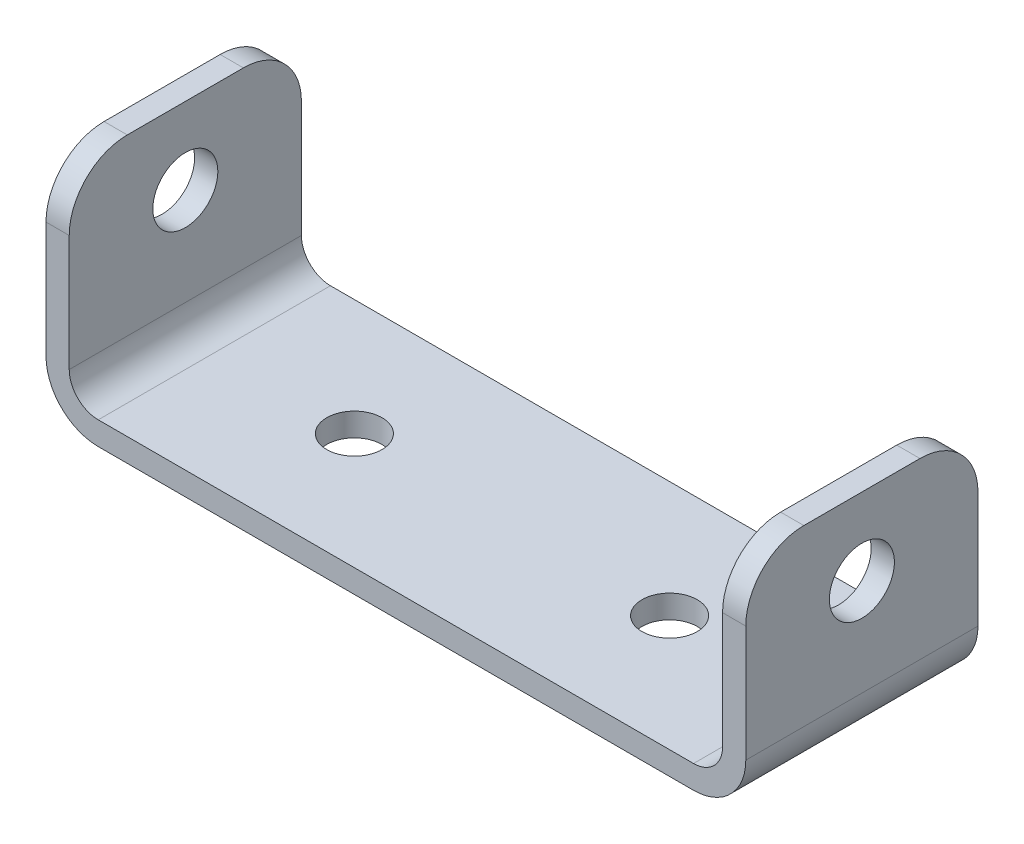
ISO-10303-21;
HEADER;
FILE_DESCRIPTION(('STEP AP214'),'2;1');
FILE_NAME('part.step','',(''),(''),'','','');
FILE_SCHEMA(('AUTOMOTIVE_DESIGN { 1 0 10303 214 1 1 1 1 }'));
ENDSEC;
DATA;
#1=APPLICATION_CONTEXT('core data for automotive mechanical design processes');
#2=APPLICATION_PROTOCOL_DEFINITION('international standard','automotive_design',2000,#1);
#3=PRODUCT_CONTEXT('',#1,'mechanical');
#4=PRODUCT('Part','Part','',(#3));
#5=PRODUCT_RELATED_PRODUCT_CATEGORY('part','',(#4));
#6=PRODUCT_DEFINITION_FORMATION('','',#4);
#7=PRODUCT_DEFINITION_CONTEXT('part definition',#1,'design');
#8=PRODUCT_DEFINITION('design','',#6,#7);
#9=PRODUCT_DEFINITION_SHAPE('','',#8);
#10=(LENGTH_UNIT() NAMED_UNIT(*) SI_UNIT(.MILLI.,.METRE.));
#11=(NAMED_UNIT(*) PLANE_ANGLE_UNIT() SI_UNIT($,.RADIAN.));
#12=(NAMED_UNIT(*) SI_UNIT($,.STERADIAN.) SOLID_ANGLE_UNIT());
#13=UNCERTAINTY_MEASURE_WITH_UNIT(LENGTH_MEASURE(1.E-05),#10,'distance_accuracy_value','');
#14=(GEOMETRIC_REPRESENTATION_CONTEXT(3) GLOBAL_UNCERTAINTY_ASSIGNED_CONTEXT((#13)) GLOBAL_UNIT_ASSIGNED_CONTEXT((#10,
#11,#12)) REPRESENTATION_CONTEXT('',''));
#15=CARTESIAN_POINT('',(0.,0.,0.));
#16=DIRECTION('',(0.,0.,1.));
#17=DIRECTION('',(1.,0.,0.));
#18=AXIS2_PLACEMENT_3D('',#15,#16,#17);
#19=CARTESIAN_POINT('',(74.0057414311546,3.175,25.4));
#20=DIRECTION('',(-1.,0.,0.));
#21=DIRECTION('',(0.,-1.,0.));
#22=AXIS2_PLACEMENT_3D('',#19,#20,#21);
#23=PLANE('',#22);
#24=CARTESIAN_POINT('',(74.0057414311546,13.8218714694836,12.7));
#25=DIRECTION('',(-1.,0.,0.));
#26=DIRECTION('',(0.,-1.,0.));
#27=AXIS2_PLACEMENT_3D('',#24,#25,#26);
#28=CIRCLE('',#27,3.556);
#29=CARTESIAN_POINT('',(74.0057414311546,10.2658714694836,12.7));
#30=VERTEX_POINT('',#29);
#31=EDGE_CURVE('E360',#30,#30,#28,.T.);
#32=ORIENTED_EDGE('',*,*,#31,.T.);
#33=EDGE_LOOP('',(#32));
#34=FACE_BOUND('',#33,.T.);
#35=DIRECTION('',(0.,1.,0.));
#36=VECTOR('',#35,1.);
#37=CARTESIAN_POINT('',(74.0057414311546,3.175,0.));
#38=LINE('',#37,#36);
#39=CARTESIAN_POINT('',(74.0057414311546,3.175,0.));
#40=VERTEX_POINT('',#39);
#41=CARTESIAN_POINT('',(74.0057414311546,15.875,0.));
#42=VERTEX_POINT('',#41);
#43=EDGE_CURVE('E190',#40,#42,#38,.T.);
#44=ORIENTED_EDGE('',*,*,#43,.T.);
#45=CARTESIAN_POINT('',(74.0057414311546,15.875,6.35));
#46=DIRECTION('',(-1.,0.,0.));
#47=DIRECTION('',(0.,-1.,0.));
#48=AXIS2_PLACEMENT_3D('',#45,#46,#47);
#49=CIRCLE('',#48,6.35);
#50=CARTESIAN_POINT('',(74.0057414311546,22.225,6.35));
#51=VERTEX_POINT('',#50);
#52=EDGE_CURVE('E250',#42,#51,#49,.F.);
#53=ORIENTED_EDGE('',*,*,#52,.T.);
#54=DIRECTION('',(0.,0.,-1.));
#55=VECTOR('',#54,1.);
#56=CARTESIAN_POINT('',(74.0057414311546,22.225,25.4));
#57=LINE('',#56,#55);
#58=CARTESIAN_POINT('',(74.0057414311546,22.225,19.05));
#59=VERTEX_POINT('',#58);
#60=EDGE_CURVE('E235',#59,#51,#57,.T.);
#61=ORIENTED_EDGE('',*,*,#60,.F.);
#62=CARTESIAN_POINT('',(74.0057414311546,15.875,19.05));
#63=DIRECTION('',(-1.,0.,0.));
#64=DIRECTION('',(0.,-1.,0.));
#65=AXIS2_PLACEMENT_3D('',#62,#63,#64);
#66=CIRCLE('',#65,6.35);
#67=CARTESIAN_POINT('',(74.0057414311546,15.875,25.4));
#68=VERTEX_POINT('',#67);
#69=EDGE_CURVE('E248',#59,#68,#66,.F.);
#70=ORIENTED_EDGE('',*,*,#69,.T.);
#71=DIRECTION('',(0.,1.,0.));
#72=VECTOR('',#71,1.);
#73=CARTESIAN_POINT('',(74.0057414311546,3.175,25.4));
#74=LINE('',#73,#72);
#75=CARTESIAN_POINT('',(74.0057414311546,3.175,25.4));
#76=VERTEX_POINT('',#75);
#77=EDGE_CURVE('E168',#76,#68,#74,.T.);
#78=ORIENTED_EDGE('',*,*,#77,.F.);
#79=DIRECTION('',(0.,0.,-1.));
#80=VECTOR('',#79,1.);
#81=CARTESIAN_POINT('',(74.0057414311546,3.175,25.4));
#82=LINE('',#81,#80);
#83=EDGE_CURVE('E189',#76,#40,#82,.T.);
#84=ORIENTED_EDGE('',*,*,#83,.T.);
#85=EDGE_LOOP('',(#44,#53,#61,#70,#78,#84));
#86=FACE_BOUND('',#85,.T.);
#87=ADVANCED_FACE('F31',(#34,#86),#23,.F.);
#88=CARTESIAN_POINT('',(71.4657414311546,22.225,25.4));
#89=DIRECTION('',(0.,1.,0.));
#90=DIRECTION('',(0.,0.,1.));
#91=AXIS2_PLACEMENT_3D('',#88,#89,#90);
#92=PLANE('',#91);
#93=ORIENTED_EDGE('',*,*,#60,.T.);
#94=DIRECTION('',(1.,0.,0.));
#95=VECTOR('',#94,1.);
#96=CARTESIAN_POINT('',(71.4657414311546,22.225,6.35));
#97=LINE('',#96,#95);
#98=CARTESIAN_POINT('',(71.4657414311546,22.225,6.35));
#99=VERTEX_POINT('',#98);
#100=EDGE_CURVE('E255',#51,#99,#97,.F.);
#101=ORIENTED_EDGE('',*,*,#100,.T.);
#102=DIRECTION('',(0.,0.,-1.));
#103=VECTOR('',#102,1.);
#104=CARTESIAN_POINT('',(71.4657414311546,22.225,25.4));
#105=LINE('',#104,#103);
#106=CARTESIAN_POINT('',(71.4657414311546,22.225,19.05));
#107=VERTEX_POINT('',#106);
#108=EDGE_CURVE('E156',#107,#99,#105,.T.);
#109=ORIENTED_EDGE('',*,*,#108,.F.);
#110=DIRECTION('',(1.,0.,0.));
#111=VECTOR('',#110,1.);
#112=CARTESIAN_POINT('',(71.4657414311546,22.225,19.05));
#113=LINE('',#112,#111);
#114=EDGE_CURVE('E252',#107,#59,#113,.T.);
#115=ORIENTED_EDGE('',*,*,#114,.T.);
#116=EDGE_LOOP('',(#93,#101,#109,#115));
#117=FACE_BOUND('',#116,.T.);
#118=ADVANCED_FACE('F303',(#117),#92,.T.);
#119=CARTESIAN_POINT('',(71.4657414311546,3.175,25.4));
#120=DIRECTION('',(-1.,0.,0.));
#121=DIRECTION('',(0.,-1.,0.));
#122=AXIS2_PLACEMENT_3D('',#119,#120,#121);
#123=PLANE('',#122);
#124=CARTESIAN_POINT('',(71.4657414311546,13.8218714694836,12.7));
#125=DIRECTION('',(-1.,0.,0.));
#126=DIRECTION('',(0.,-1.,0.));
#127=AXIS2_PLACEMENT_3D('',#124,#125,#126);
#128=CIRCLE('',#127,3.556);
#129=CARTESIAN_POINT('',(71.4657414311546,10.2658714694836,12.7));
#130=VERTEX_POINT('',#129);
#131=EDGE_CURVE('E358',#130,#130,#128,.T.);
#132=ORIENTED_EDGE('',*,*,#131,.F.);
#133=EDGE_LOOP('',(#132));
#134=FACE_BOUND('',#133,.T.);
#135=ORIENTED_EDGE('',*,*,#108,.T.);
#136=CARTESIAN_POINT('',(71.4657414311546,15.875,6.35));
#137=DIRECTION('',(-1.,0.,0.));
#138=DIRECTION('',(0.,-1.,0.));
#139=AXIS2_PLACEMENT_3D('',#136,#137,#138);
#140=CIRCLE('',#139,6.35);
#141=CARTESIAN_POINT('',(71.4657414311546,15.875,0.));
#142=VERTEX_POINT('',#141);
#143=EDGE_CURVE('E259',#99,#142,#140,.T.);
#144=ORIENTED_EDGE('',*,*,#143,.T.);
#145=DIRECTION('',(0.,1.,0.));
#146=VECTOR('',#145,1.);
#147=CARTESIAN_POINT('',(71.4657414311546,3.175,0.));
#148=LINE('',#147,#146);
#149=CARTESIAN_POINT('',(71.4657414311546,3.175,0.));
#150=VERTEX_POINT('',#149);
#151=EDGE_CURVE('E151',#150,#142,#148,.T.);
#152=ORIENTED_EDGE('',*,*,#151,.F.);
#153=DIRECTION('',(0.,0.,-1.));
#154=VECTOR('',#153,1.);
#155=CARTESIAN_POINT('',(71.4657414311546,3.175,25.4));
#156=LINE('',#155,#154);
#157=CARTESIAN_POINT('',(71.4657414311546,3.175,25.4));
#158=VERTEX_POINT('',#157);
#159=EDGE_CURVE('E144',#158,#150,#156,.T.);
#160=ORIENTED_EDGE('',*,*,#159,.F.);
#161=DIRECTION('',(0.,1.,0.));
#162=VECTOR('',#161,1.);
#163=CARTESIAN_POINT('',(71.4657414311546,3.175,25.4));
#164=LINE('',#163,#162);
#165=CARTESIAN_POINT('',(71.4657414311546,15.875,25.4));
#166=VERTEX_POINT('',#165);
#167=EDGE_CURVE('E148',#158,#166,#164,.T.);
#168=ORIENTED_EDGE('',*,*,#167,.T.);
#169=CARTESIAN_POINT('',(71.4657414311546,15.875,19.05));
#170=DIRECTION('',(-1.,0.,0.));
#171=DIRECTION('',(0.,-1.,0.));
#172=AXIS2_PLACEMENT_3D('',#169,#170,#171);
#173=CIRCLE('',#172,6.35);
#174=EDGE_CURVE('E257',#166,#107,#173,.T.);
#175=ORIENTED_EDGE('',*,*,#174,.T.);
#176=EDGE_LOOP('',(#135,#144,#152,#160,#168,#175));
#177=FACE_BOUND('',#176,.T.);
#178=ADVANCED_FACE('F147',(#134,#177),#123,.T.);
#179=CARTESIAN_POINT('',(68.2907414311546,3.175,25.4));
#180=DIRECTION('',(0.,0.,-1.));
#181=DIRECTION('',(-1.,0.,0.));
#182=AXIS2_PLACEMENT_3D('',#179,#180,#181);
#183=CYLINDRICAL_SURFACE('',#182,3.17500000000001);
#184=CARTESIAN_POINT('',(68.2907414311546,3.175,0.));
#185=DIRECTION('',(0.,0.,1.));
#186=DIRECTION('',(1.,0.,0.));
#187=AXIS2_PLACEMENT_3D('',#184,#185,#186);
#188=CIRCLE('',#187,3.17500000000001);
#189=CARTESIAN_POINT('',(68.2907414311546,0.,0.));
#190=VERTEX_POINT('',#189);
#191=EDGE_CURVE('E195',#190,#150,#188,.T.);
#192=ORIENTED_EDGE('',*,*,#191,.F.);
#193=DIRECTION('',(0.,0.,-1.));
#194=VECTOR('',#193,1.);
#195=CARTESIAN_POINT('',(68.2907414311546,0.,25.4));
#196=LINE('',#195,#194);
#197=CARTESIAN_POINT('',(68.2907414311546,0.,25.4));
#198=VERTEX_POINT('',#197);
#199=EDGE_CURVE('E157',#198,#190,#196,.T.);
#200=ORIENTED_EDGE('',*,*,#199,.F.);
#201=CARTESIAN_POINT('',(68.2907414311546,3.175,25.4));
#202=DIRECTION('',(0.,0.,1.));
#203=DIRECTION('',(1.,0.,0.));
#204=AXIS2_PLACEMENT_3D('',#201,#202,#203);
#205=CIRCLE('',#204,3.17500000000001);
#206=EDGE_CURVE('E164',#198,#158,#205,.T.);
#207=ORIENTED_EDGE('',*,*,#206,.T.);
#208=ORIENTED_EDGE('',*,*,#159,.T.);
#209=EDGE_LOOP('',(#192,#200,#207,#208));
#210=FACE_BOUND('',#209,.T.);
#211=ADVANCED_FACE('F170',(#210),#183,.F.);
#212=CARTESIAN_POINT('',(3.175,0.,25.4));
#213=DIRECTION('',(0.,1.,0.));
#214=DIRECTION('',(0.,0.,1.));
#215=AXIS2_PLACEMENT_3D('',#212,#213,#214);
#216=PLANE('',#215);
#217=CARTESIAN_POINT('',(52.97246284605,0.,12.7));
#218=DIRECTION('',(0.,1.,0.));
#219=DIRECTION('',(0.,0.,-1.));
#220=AXIS2_PLACEMENT_3D('',#217,#218,#219);
#221=CIRCLE('',#220,3.02197659635452);
#222=CARTESIAN_POINT('',(52.97246284605,0.,9.67802340364548));
#223=VERTEX_POINT('',#222);
#224=EDGE_CURVE('E362',#223,#223,#221,.T.);
#225=ORIENTED_EDGE('',*,*,#224,.F.);
#226=EDGE_LOOP('',(#225));
#227=FACE_BOUND('',#226,.T.);
#228=CARTESIAN_POINT('',(18.4932785851046,0.,12.7));
#229=DIRECTION('',(0.,1.,0.));
#230=DIRECTION('',(0.,0.,1.));
#231=AXIS2_PLACEMENT_3D('',#228,#229,#230);
#232=CIRCLE('',#231,3.02197659635452);
#233=CARTESIAN_POINT('',(18.4932785851046,0.,15.7219765963545));
#234=VERTEX_POINT('',#233);
#235=EDGE_CURVE('E370',#234,#234,#232,.T.);
#236=ORIENTED_EDGE('',*,*,#235,.F.);
#237=EDGE_LOOP('',(#236));
#238=FACE_BOUND('',#237,.T.);
#239=DIRECTION('',(1.,0.,0.));
#240=VECTOR('',#239,1.);
#241=CARTESIAN_POINT('',(3.175,0.,0.));
#242=LINE('',#241,#240);
#243=CARTESIAN_POINT('',(3.175,0.,0.));
#244=VERTEX_POINT('',#243);
#245=EDGE_CURVE('E197',#244,#190,#242,.T.);
#246=ORIENTED_EDGE('',*,*,#245,.F.);
#247=DIRECTION('',(0.,0.,-1.));
#248=VECTOR('',#247,1.);
#249=CARTESIAN_POINT('',(3.175,0.,25.4));
#250=LINE('',#249,#248);
#251=CARTESIAN_POINT('',(3.175,0.,25.4));
#252=VERTEX_POINT('',#251);
#253=EDGE_CURVE('E231',#252,#244,#250,.T.);
#254=ORIENTED_EDGE('',*,*,#253,.F.);
#255=DIRECTION('',(1.,0.,0.));
#256=VECTOR('',#255,1.);
#257=CARTESIAN_POINT('',(3.175,0.,25.4));
#258=LINE('',#257,#256);
#259=EDGE_CURVE('E171',#252,#198,#258,.T.);
#260=ORIENTED_EDGE('',*,*,#259,.T.);
#261=ORIENTED_EDGE('',*,*,#199,.T.);
#262=EDGE_LOOP('',(#246,#254,#260,#261));
#263=FACE_BOUND('',#262,.T.);
#264=ADVANCED_FACE('F334',(#227,#238,#263),#216,.T.);
#265=CARTESIAN_POINT('',(3.175,3.175,25.4));
#266=DIRECTION('',(0.,0.,-1.));
#267=DIRECTION('',(-1.,0.,0.));
#268=AXIS2_PLACEMENT_3D('',#265,#266,#267);
#269=CYLINDRICAL_SURFACE('',#268,3.175);
#270=CARTESIAN_POINT('',(3.175,3.175,0.));
#271=DIRECTION('',(0.,0.,1.));
#272=DIRECTION('',(1.,0.,0.));
#273=AXIS2_PLACEMENT_3D('',#270,#271,#272);
#274=CIRCLE('',#273,3.175);
#275=CARTESIAN_POINT('',(0.,3.175,0.));
#276=VERTEX_POINT('',#275);
#277=EDGE_CURVE('E200',#276,#244,#274,.T.);
#278=ORIENTED_EDGE('',*,*,#277,.F.);
#279=DIRECTION('',(0.,0.,-1.));
#280=VECTOR('',#279,1.);
#281=CARTESIAN_POINT('',(0.,3.175,25.4));
#282=LINE('',#281,#280);
#283=CARTESIAN_POINT('',(0.,3.175,25.4));
#284=VERTEX_POINT('',#283);
#285=EDGE_CURVE('E228',#284,#276,#282,.T.);
#286=ORIENTED_EDGE('',*,*,#285,.F.);
#287=CARTESIAN_POINT('',(3.175,3.175,25.4));
#288=DIRECTION('',(0.,0.,1.));
#289=DIRECTION('',(1.,0.,0.));
#290=AXIS2_PLACEMENT_3D('',#287,#288,#289);
#291=CIRCLE('',#290,3.175);
#292=EDGE_CURVE('E173',#284,#252,#291,.T.);
#293=ORIENTED_EDGE('',*,*,#292,.T.);
#294=ORIENTED_EDGE('',*,*,#253,.T.);
#295=EDGE_LOOP('',(#278,#286,#293,#294));
#296=FACE_BOUND('',#295,.T.);
#297=ADVANCED_FACE('F338',(#296),#269,.F.);
#298=CARTESIAN_POINT('',(0.,22.225,25.4));
#299=DIRECTION('',(1.,0.,0.));
#300=DIRECTION('',(0.,1.,0.));
#301=AXIS2_PLACEMENT_3D('',#298,#299,#300);
#302=PLANE('',#301);
#303=CARTESIAN_POINT('',(0.,13.8218714694836,12.7));
#304=DIRECTION('',(1.,0.,0.));
#305=DIRECTION('',(0.,1.,0.));
#306=AXIS2_PLACEMENT_3D('',#303,#304,#305);
#307=CIRCLE('',#306,3.556);
#308=CARTESIAN_POINT('',(0.,17.3778714694836,12.7));
#309=VERTEX_POINT('',#308);
#310=EDGE_CURVE('E242',#309,#309,#307,.T.);
#311=ORIENTED_EDGE('',*,*,#310,.F.);
#312=EDGE_LOOP('',(#311));
#313=FACE_BOUND('',#312,.T.);
#314=DIRECTION('',(0.,-1.,0.));
#315=VECTOR('',#314,1.);
#316=CARTESIAN_POINT('',(0.,22.225,0.));
#317=LINE('',#316,#315);
#318=CARTESIAN_POINT('',(0.,15.875,0.));
#319=VERTEX_POINT('',#318);
#320=EDGE_CURVE('E203',#319,#276,#317,.T.);
#321=ORIENTED_EDGE('',*,*,#320,.F.);
#322=CARTESIAN_POINT('',(0.,15.875,6.35));
#323=DIRECTION('',(1.,0.,0.));
#324=DIRECTION('',(0.,1.,0.));
#325=AXIS2_PLACEMENT_3D('',#322,#323,#324);
#326=CIRCLE('',#325,6.35);
#327=CARTESIAN_POINT('',(0.,22.225,6.35));
#328=VERTEX_POINT('',#327);
#329=EDGE_CURVE('E266',#319,#328,#326,.T.);
#330=ORIENTED_EDGE('',*,*,#329,.T.);
#331=DIRECTION('',(0.,0.,-1.));
#332=VECTOR('',#331,1.);
#333=CARTESIAN_POINT('',(0.,22.225,25.4));
#334=LINE('',#333,#332);
#335=CARTESIAN_POINT('',(0.,22.225,19.05));
#336=VERTEX_POINT('',#335);
#337=EDGE_CURVE('E226',#336,#328,#334,.T.);
#338=ORIENTED_EDGE('',*,*,#337,.F.);
#339=CARTESIAN_POINT('',(0.,15.875,19.05));
#340=DIRECTION('',(1.,0.,0.));
#341=DIRECTION('',(0.,1.,0.));
#342=AXIS2_PLACEMENT_3D('',#339,#340,#341);
#343=CIRCLE('',#342,6.35);
#344=CARTESIAN_POINT('',(0.,15.875,25.4));
#345=VERTEX_POINT('',#344);
#346=EDGE_CURVE('E264',#336,#345,#343,.T.);
#347=ORIENTED_EDGE('',*,*,#346,.T.);
#348=DIRECTION('',(0.,-1.,0.));
#349=VECTOR('',#348,1.);
#350=CARTESIAN_POINT('',(0.,22.225,25.4));
#351=LINE('',#350,#349);
#352=EDGE_CURVE('E179',#345,#284,#351,.T.);
#353=ORIENTED_EDGE('',*,*,#352,.T.);
#354=ORIENTED_EDGE('',*,*,#285,.T.);
#355=EDGE_LOOP('',(#321,#330,#338,#347,#353,#354));
#356=FACE_BOUND('',#355,.T.);
#357=ADVANCED_FACE('F277',(#313,#356),#302,.T.);
#358=CARTESIAN_POINT('',(-2.54,22.225,25.4));
#359=DIRECTION('',(0.,1.,0.));
#360=DIRECTION('',(0.,0.,1.));
#361=AXIS2_PLACEMENT_3D('',#358,#359,#360);
#362=PLANE('',#361);
#363=ORIENTED_EDGE('',*,*,#337,.T.);
#364=DIRECTION('',(1.,0.,0.));
#365=VECTOR('',#364,1.);
#366=CARTESIAN_POINT('',(-2.54,22.225,6.35));
#367=LINE('',#366,#365);
#368=CARTESIAN_POINT('',(-2.54,22.225,6.35));
#369=VERTEX_POINT('',#368);
#370=EDGE_CURVE('E46',#328,#369,#367,.F.);
#371=ORIENTED_EDGE('',*,*,#370,.T.);
#372=DIRECTION('',(0.,0.,-1.));
#373=VECTOR('',#372,1.);
#374=CARTESIAN_POINT('',(-2.54,22.225,25.4));
#375=LINE('',#374,#373);
#376=CARTESIAN_POINT('',(-2.54,22.225,19.05));
#377=VERTEX_POINT('',#376);
#378=EDGE_CURVE('E224',#377,#369,#375,.T.);
#379=ORIENTED_EDGE('',*,*,#378,.F.);
#380=DIRECTION('',(1.,0.,0.));
#381=VECTOR('',#380,1.);
#382=CARTESIAN_POINT('',(-2.54,22.225,19.05));
#383=LINE('',#382,#381);
#384=EDGE_CURVE('E268',#377,#336,#383,.T.);
#385=ORIENTED_EDGE('',*,*,#384,.T.);
#386=EDGE_LOOP('',(#363,#371,#379,#385));
#387=FACE_BOUND('',#386,.T.);
#388=ADVANCED_FACE('F273',(#387),#362,.T.);
#389=CARTESIAN_POINT('',(-2.54,22.225,25.4));
#390=DIRECTION('',(1.,0.,0.));
#391=DIRECTION('',(0.,1.,0.));
#392=AXIS2_PLACEMENT_3D('',#389,#390,#391);
#393=PLANE('',#392);
#394=CARTESIAN_POINT('',(-2.54,13.8218714694836,12.7));
#395=DIRECTION('',(1.,0.,0.));
#396=DIRECTION('',(0.,1.,0.));
#397=AXIS2_PLACEMENT_3D('',#394,#395,#396);
#398=CIRCLE('',#397,3.556);
#399=CARTESIAN_POINT('',(-2.54,17.3778714694836,12.7));
#400=VERTEX_POINT('',#399);
#401=EDGE_CURVE('E239',#400,#400,#398,.T.);
#402=ORIENTED_EDGE('',*,*,#401,.T.);
#403=EDGE_LOOP('',(#402));
#404=FACE_BOUND('',#403,.T.);
#405=ORIENTED_EDGE('',*,*,#378,.T.);
#406=CARTESIAN_POINT('',(-2.54,15.875,6.35));
#407=DIRECTION('',(1.,0.,0.));
#408=DIRECTION('',(0.,1.,0.));
#409=AXIS2_PLACEMENT_3D('',#406,#407,#408);
#410=CIRCLE('',#409,6.35);
#411=CARTESIAN_POINT('',(-2.54,15.875,0.));
#412=VERTEX_POINT('',#411);
#413=EDGE_CURVE('E11',#369,#412,#410,.F.);
#414=ORIENTED_EDGE('',*,*,#413,.T.);
#415=DIRECTION('',(0.,-1.,0.));
#416=VECTOR('',#415,1.);
#417=CARTESIAN_POINT('',(-2.54,22.225,0.));
#418=LINE('',#417,#416);
#419=CARTESIAN_POINT('',(-2.54,3.175,0.));
#420=VERTEX_POINT('',#419);
#421=EDGE_CURVE('E205',#412,#420,#418,.T.);
#422=ORIENTED_EDGE('',*,*,#421,.T.);
#423=DIRECTION('',(0.,0.,-1.));
#424=VECTOR('',#423,1.);
#425=CARTESIAN_POINT('',(-2.54,3.175,25.4));
#426=LINE('',#425,#424);
#427=CARTESIAN_POINT('',(-2.54,3.175,25.4));
#428=VERTEX_POINT('',#427);
#429=EDGE_CURVE('E221',#428,#420,#426,.T.);
#430=ORIENTED_EDGE('',*,*,#429,.F.);
#431=DIRECTION('',(0.,-1.,0.));
#432=VECTOR('',#431,1.);
#433=CARTESIAN_POINT('',(-2.54,22.225,25.4));
#434=LINE('',#433,#432);
#435=CARTESIAN_POINT('',(-2.54,15.875,25.4));
#436=VERTEX_POINT('',#435);
#437=EDGE_CURVE('E181',#436,#428,#434,.T.);
#438=ORIENTED_EDGE('',*,*,#437,.F.);
#439=CARTESIAN_POINT('',(-2.54,15.875,19.05));
#440=DIRECTION('',(1.,0.,0.));
#441=DIRECTION('',(0.,1.,0.));
#442=AXIS2_PLACEMENT_3D('',#439,#440,#441);
#443=CIRCLE('',#442,6.35);
#444=EDGE_CURVE('E39',#436,#377,#443,.F.);
#445=ORIENTED_EDGE('',*,*,#444,.T.);
#446=EDGE_LOOP('',(#405,#414,#422,#430,#438,#445));
#447=FACE_BOUND('',#446,.T.);
#448=ADVANCED_FACE('F289',(#404,#447),#393,.F.);
#449=CARTESIAN_POINT('',(3.175,3.175,25.4));
#450=DIRECTION('',(0.,0.,-1.));
#451=DIRECTION('',(-1.,0.,0.));
#452=AXIS2_PLACEMENT_3D('',#449,#450,#451);
#453=CYLINDRICAL_SURFACE('',#452,5.715);
#454=CARTESIAN_POINT('',(3.175,3.175,0.));
#455=DIRECTION('',(0.,0.,1.));
#456=DIRECTION('',(1.,0.,0.));
#457=AXIS2_PLACEMENT_3D('',#454,#455,#456);
#458=CIRCLE('',#457,5.715);
#459=CARTESIAN_POINT('',(3.175,-2.54,0.));
#460=VERTEX_POINT('',#459);
#461=EDGE_CURVE('E207',#420,#460,#458,.T.);
#462=ORIENTED_EDGE('',*,*,#461,.T.);
#463=DIRECTION('',(0.,0.,-1.));
#464=VECTOR('',#463,1.);
#465=CARTESIAN_POINT('',(3.175,-2.54,25.4));
#466=LINE('',#465,#464);
#467=CARTESIAN_POINT('',(3.175,-2.54,25.4));
#468=VERTEX_POINT('',#467);
#469=EDGE_CURVE('E218',#468,#460,#466,.T.);
#470=ORIENTED_EDGE('',*,*,#469,.F.);
#471=CARTESIAN_POINT('',(3.175,3.175,25.4));
#472=DIRECTION('',(0.,0.,1.));
#473=DIRECTION('',(1.,0.,0.));
#474=AXIS2_PLACEMENT_3D('',#471,#472,#473);
#475=CIRCLE('',#474,5.715);
#476=EDGE_CURVE('E183',#428,#468,#475,.T.);
#477=ORIENTED_EDGE('',*,*,#476,.F.);
#478=ORIENTED_EDGE('',*,*,#429,.T.);
#479=EDGE_LOOP('',(#462,#470,#477,#478));
#480=FACE_BOUND('',#479,.T.);
#481=ADVANCED_FACE('F292',(#480),#453,.T.);
#482=CARTESIAN_POINT('',(3.175,-2.54,25.4));
#483=DIRECTION('',(0.,1.,0.));
#484=DIRECTION('',(0.,0.,1.));
#485=AXIS2_PLACEMENT_3D('',#482,#483,#484);
#486=PLANE('',#485);
#487=CARTESIAN_POINT('',(52.97246284605,-2.54000000000001,12.7));
#488=DIRECTION('',(0.,1.,0.));
#489=DIRECTION('',(0.,0.,-1.));
#490=AXIS2_PLACEMENT_3D('',#487,#488,#489);
#491=CIRCLE('',#490,3.02197659635452);
#492=CARTESIAN_POINT('',(52.97246284605,-2.54000000000001,9.67802340364548));
#493=VERTEX_POINT('',#492);
#494=EDGE_CURVE('E367',#493,#493,#491,.T.);
#495=ORIENTED_EDGE('',*,*,#494,.T.);
#496=EDGE_LOOP('',(#495));
#497=FACE_BOUND('',#496,.T.);
#498=CARTESIAN_POINT('',(18.4932785851046,-2.54000000000001,12.7));
#499=DIRECTION('',(0.,1.,0.));
#500=DIRECTION('',(0.,0.,1.));
#501=AXIS2_PLACEMENT_3D('',#498,#499,#500);
#502=CIRCLE('',#501,3.02197659635452);
#503=CARTESIAN_POINT('',(18.4932785851046,-2.54000000000001,15.7219765963545));
#504=VERTEX_POINT('',#503);
#505=EDGE_CURVE('E193',#504,#504,#502,.T.);
#506=ORIENTED_EDGE('',*,*,#505,.T.);
#507=EDGE_LOOP('',(#506));
#508=FACE_BOUND('',#507,.T.);
#509=DIRECTION('',(1.,0.,0.));
#510=VECTOR('',#509,1.);
#511=CARTESIAN_POINT('',(3.175,-2.54,0.));
#512=LINE('',#511,#510);
#513=CARTESIAN_POINT('',(68.2907414311546,-2.54000000000001,0.));
#514=VERTEX_POINT('',#513);
#515=EDGE_CURVE('E209',#460,#514,#512,.T.);
#516=ORIENTED_EDGE('',*,*,#515,.T.);
#517=DIRECTION('',(0.,0.,-1.));
#518=VECTOR('',#517,1.);
#519=CARTESIAN_POINT('',(68.2907414311546,-2.54000000000001,25.4));
#520=LINE('',#519,#518);
#521=CARTESIAN_POINT('',(68.2907414311546,-2.54000000000001,25.4));
#522=VERTEX_POINT('',#521);
#523=EDGE_CURVE('E215',#522,#514,#520,.T.);
#524=ORIENTED_EDGE('',*,*,#523,.F.);
#525=DIRECTION('',(1.,0.,0.));
#526=VECTOR('',#525,1.);
#527=CARTESIAN_POINT('',(3.175,-2.54,25.4));
#528=LINE('',#527,#526);
#529=EDGE_CURVE('E185',#468,#522,#528,.T.);
#530=ORIENTED_EDGE('',*,*,#529,.F.);
#531=ORIENTED_EDGE('',*,*,#469,.T.);
#532=EDGE_LOOP('',(#516,#524,#530,#531));
#533=FACE_BOUND('',#532,.T.);
#534=ADVANCED_FACE('F383',(#497,#508,#533),#486,.F.);
#535=CARTESIAN_POINT('',(68.2907414311546,3.175,25.4));
#536=DIRECTION('',(0.,0.,-1.));
#537=DIRECTION('',(-1.,0.,0.));
#538=AXIS2_PLACEMENT_3D('',#535,#536,#537);
#539=CYLINDRICAL_SURFACE('',#538,5.71500000000001);
#540=CARTESIAN_POINT('',(68.2907414311546,3.175,0.));
#541=DIRECTION('',(0.,0.,1.));
#542=DIRECTION('',(1.,0.,0.));
#543=AXIS2_PLACEMENT_3D('',#540,#541,#542);
#544=CIRCLE('',#543,5.71500000000001);
#545=EDGE_CURVE('E211',#514,#40,#544,.T.);
#546=ORIENTED_EDGE('',*,*,#545,.T.);
#547=ORIENTED_EDGE('',*,*,#83,.F.);
#548=CARTESIAN_POINT('',(68.2907414311546,3.175,25.4));
#549=DIRECTION('',(0.,0.,1.));
#550=DIRECTION('',(1.,0.,0.));
#551=AXIS2_PLACEMENT_3D('',#548,#549,#550);
#552=CIRCLE('',#551,5.71500000000001);
#553=EDGE_CURVE('E187',#522,#76,#552,.T.);
#554=ORIENTED_EDGE('',*,*,#553,.F.);
#555=ORIENTED_EDGE('',*,*,#523,.T.);
#556=EDGE_LOOP('',(#546,#547,#554,#555));
#557=FACE_BOUND('',#556,.T.);
#558=ADVANCED_FACE('F381',(#557),#539,.T.);
#559=CARTESIAN_POINT('',(68.2907414311546,3.175,25.4));
#560=DIRECTION('',(0.,0.,1.));
#561=DIRECTION('',(1.,0.,0.));
#562=AXIS2_PLACEMENT_3D('',#559,#560,#561);
#563=PLANE('',#562);
#564=ORIENTED_EDGE('',*,*,#77,.T.);
#565=DIRECTION('',(1.,0.,0.));
#566=VECTOR('',#565,1.);
#567=CARTESIAN_POINT('',(68.2907414311546,15.875,25.4));
#568=LINE('',#567,#566);
#569=EDGE_CURVE('E167',#68,#166,#568,.F.);
#570=ORIENTED_EDGE('',*,*,#569,.T.);
#571=ORIENTED_EDGE('',*,*,#167,.F.);
#572=ORIENTED_EDGE('',*,*,#206,.F.);
#573=ORIENTED_EDGE('',*,*,#259,.F.);
#574=ORIENTED_EDGE('',*,*,#292,.F.);
#575=ORIENTED_EDGE('',*,*,#352,.F.);
#576=DIRECTION('',(1.,0.,0.));
#577=VECTOR('',#576,1.);
#578=CARTESIAN_POINT('',(68.2907414311546,15.875,25.4));
#579=LINE('',#578,#577);
#580=EDGE_CURVE('E261',#345,#436,#579,.F.);
#581=ORIENTED_EDGE('',*,*,#580,.T.);
#582=ORIENTED_EDGE('',*,*,#437,.T.);
#583=ORIENTED_EDGE('',*,*,#476,.T.);
#584=ORIENTED_EDGE('',*,*,#529,.T.);
#585=ORIENTED_EDGE('',*,*,#553,.T.);
#586=EDGE_LOOP('',(#564,#570,#571,#572,#573,#574,#575,#581,#582,#583,#584,#585));
#587=FACE_BOUND('',#586,.T.);
#588=ADVANCED_FACE('F162',(#587),#563,.T.);
#589=CARTESIAN_POINT('',(68.2907414311546,3.175,0.));
#590=DIRECTION('',(0.,0.,1.));
#591=DIRECTION('',(1.,0.,0.));
#592=AXIS2_PLACEMENT_3D('',#589,#590,#591);
#593=PLANE('',#592);
#594=ORIENTED_EDGE('',*,*,#151,.T.);
#595=DIRECTION('',(1.,0.,0.));
#596=VECTOR('',#595,1.);
#597=CARTESIAN_POINT('',(74.0057414311546,15.875,0.));
#598=LINE('',#597,#596);
#599=EDGE_CURVE('E245',#142,#42,#598,.T.);
#600=ORIENTED_EDGE('',*,*,#599,.T.);
#601=ORIENTED_EDGE('',*,*,#43,.F.);
#602=ORIENTED_EDGE('',*,*,#545,.F.);
#603=ORIENTED_EDGE('',*,*,#515,.F.);
#604=ORIENTED_EDGE('',*,*,#461,.F.);
#605=ORIENTED_EDGE('',*,*,#421,.F.);
#606=DIRECTION('',(1.,0.,0.));
#607=VECTOR('',#606,1.);
#608=CARTESIAN_POINT('',(0.,15.875,0.));
#609=LINE('',#608,#607);
#610=EDGE_CURVE('E238',#412,#319,#609,.T.);
#611=ORIENTED_EDGE('',*,*,#610,.T.);
#612=ORIENTED_EDGE('',*,*,#320,.T.);
#613=ORIENTED_EDGE('',*,*,#277,.T.);
#614=ORIENTED_EDGE('',*,*,#245,.T.);
#615=ORIENTED_EDGE('',*,*,#191,.T.);
#616=EDGE_LOOP('',(#594,#600,#601,#602,#603,#604,#605,#611,#612,#613,#614,#615));
#617=FACE_BOUND('',#616,.T.);
#618=ADVANCED_FACE('F285',(#617),#593,.F.);
#619=CARTESIAN_POINT('',(18.4932785851046,-2.54000000000001,12.7));
#620=DIRECTION('',(0.,1.,0.));
#621=DIRECTION('',(0.,0.,1.));
#622=AXIS2_PLACEMENT_3D('',#619,#620,#621);
#623=CYLINDRICAL_SURFACE('',#622,3.02197659635452);
#624=ORIENTED_EDGE('',*,*,#505,.F.);
#625=EDGE_LOOP('',(#624));
#626=FACE_BOUND('',#625,.T.);
#627=ORIENTED_EDGE('',*,*,#235,.T.);
#628=EDGE_LOOP('',(#627));
#629=FACE_BOUND('',#628,.T.);
#630=ADVANCED_FACE('F439',(#626,#629),#623,.F.);
#631=CARTESIAN_POINT('',(52.97246284605,-2.54000000000001,12.7));
#632=DIRECTION('',(0.,1.,0.));
#633=DIRECTION('',(0.,0.,1.));
#634=AXIS2_PLACEMENT_3D('',#631,#632,#633);
#635=CYLINDRICAL_SURFACE('',#634,3.02197659635452);
#636=ORIENTED_EDGE('',*,*,#494,.F.);
#637=EDGE_LOOP('',(#636));
#638=FACE_BOUND('',#637,.T.);
#639=ORIENTED_EDGE('',*,*,#224,.T.);
#640=EDGE_LOOP('',(#639));
#641=FACE_BOUND('',#640,.T.);
#642=ADVANCED_FACE('F444',(#638,#641),#635,.F.);
#643=CARTESIAN_POINT('',(-81.5340000000001,13.8218714694836,12.7));
#644=DIRECTION('',(1.,0.,0.));
#645=DIRECTION('',(0.,0.,-1.));
#646=AXIS2_PLACEMENT_3D('',#643,#644,#645);
#647=CYLINDRICAL_SURFACE('',#646,3.556);
#648=ORIENTED_EDGE('',*,*,#310,.T.);
#649=EDGE_LOOP('',(#648));
#650=FACE_BOUND('',#649,.T.);
#651=ORIENTED_EDGE('',*,*,#401,.F.);
#652=EDGE_LOOP('',(#651));
#653=FACE_BOUND('',#652,.T.);
#654=ADVANCED_FACE('F456',(#650,#653),#647,.F.);
#655=ORIENTED_EDGE('',*,*,#131,.T.);
#656=EDGE_LOOP('',(#655));
#657=FACE_BOUND('',#656,.T.);
#658=ORIENTED_EDGE('',*,*,#31,.F.);
#659=EDGE_LOOP('',(#658));
#660=FACE_BOUND('',#659,.T.);
#661=ADVANCED_FACE('F318',(#657,#660),#647,.F.);
#662=CARTESIAN_POINT('',(68.2907414311546,15.875,6.35));
#663=DIRECTION('',(-1.,0.,0.));
#664=DIRECTION('',(0.,0.,1.));
#665=AXIS2_PLACEMENT_3D('',#662,#663,#664);
#666=CYLINDRICAL_SURFACE('',#665,6.35);
#667=ORIENTED_EDGE('',*,*,#143,.F.);
#668=ORIENTED_EDGE('',*,*,#100,.F.);
#669=ORIENTED_EDGE('',*,*,#52,.F.);
#670=ORIENTED_EDGE('',*,*,#599,.F.);
#671=EDGE_LOOP('',(#667,#668,#669,#670));
#672=FACE_BOUND('',#671,.T.);
#673=ADVANCED_FACE('F315',(#672),#666,.T.);
#674=CARTESIAN_POINT('',(71.4657414311546,15.875,19.05));
#675=DIRECTION('',(1.,0.,0.));
#676=DIRECTION('',(0.,0.,-1.));
#677=AXIS2_PLACEMENT_3D('',#674,#675,#676);
#678=CYLINDRICAL_SURFACE('',#677,6.35);
#679=ORIENTED_EDGE('',*,*,#174,.F.);
#680=ORIENTED_EDGE('',*,*,#569,.F.);
#681=ORIENTED_EDGE('',*,*,#69,.F.);
#682=ORIENTED_EDGE('',*,*,#114,.F.);
#683=EDGE_LOOP('',(#679,#680,#681,#682));
#684=FACE_BOUND('',#683,.T.);
#685=ADVANCED_FACE('F301',(#684),#678,.T.);
#686=CARTESIAN_POINT('',(68.2907414311546,15.875,6.35));
#687=DIRECTION('',(-1.,0.,0.));
#688=DIRECTION('',(0.,0.,1.));
#689=AXIS2_PLACEMENT_3D('',#686,#687,#688);
#690=CYLINDRICAL_SURFACE('',#689,6.35);
#691=ORIENTED_EDGE('',*,*,#413,.F.);
#692=ORIENTED_EDGE('',*,*,#370,.F.);
#693=ORIENTED_EDGE('',*,*,#329,.F.);
#694=ORIENTED_EDGE('',*,*,#610,.F.);
#695=EDGE_LOOP('',(#691,#692,#693,#694));
#696=FACE_BOUND('',#695,.T.);
#697=ADVANCED_FACE('F282',(#696),#690,.T.);
#698=CARTESIAN_POINT('',(-2.54,15.875,19.05));
#699=DIRECTION('',(1.,0.,0.));
#700=DIRECTION('',(0.,0.,-1.));
#701=AXIS2_PLACEMENT_3D('',#698,#699,#700);
#702=CYLINDRICAL_SURFACE('',#701,6.35);
#703=ORIENTED_EDGE('',*,*,#444,.F.);
#704=ORIENTED_EDGE('',*,*,#580,.F.);
#705=ORIENTED_EDGE('',*,*,#346,.F.);
#706=ORIENTED_EDGE('',*,*,#384,.F.);
#707=EDGE_LOOP('',(#703,#704,#705,#706));
#708=FACE_BOUND('',#707,.T.);
#709=ADVANCED_FACE('F33',(#708),#702,.T.);
#710=CLOSED_SHELL('',(#87,#118,#178,#211,#264,#297,#357,#388,#448,#481,#534,#558,#588,#618,#630,
#642,#654,#661,#673,#685,#697,#709));
#711=MANIFOLD_SOLID_BREP('B2',#710);
#712=ADVANCED_BREP_SHAPE_REPRESENTATION('',(#18,#711),#14);
#713=SHAPE_DEFINITION_REPRESENTATION(#9,#712);
ENDSEC;
END-ISO-10303-21;
